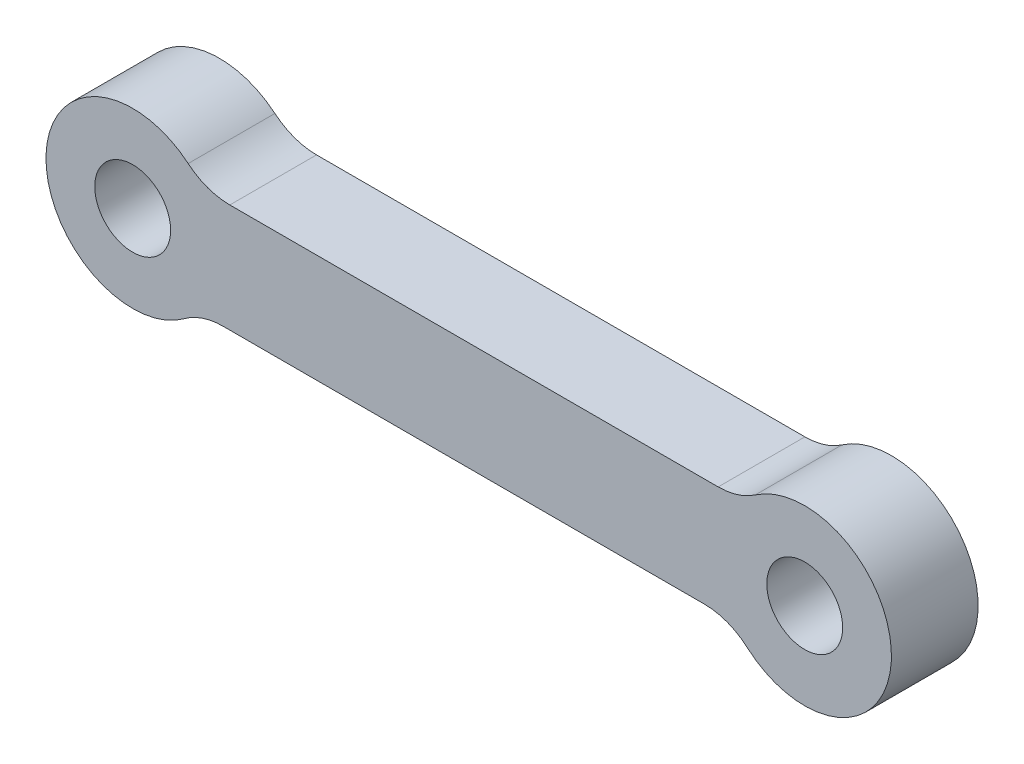
ISO-10303-21;
HEADER;
FILE_DESCRIPTION(('STEP AP214'),'2;1');
FILE_NAME('part.step','',(''),(''),'','','');
FILE_SCHEMA(('AUTOMOTIVE_DESIGN { 1 0 10303 214 1 1 1 1 }'));
ENDSEC;
DATA;
#1=APPLICATION_CONTEXT('core data for automotive mechanical design processes');
#2=APPLICATION_PROTOCOL_DEFINITION('international standard','automotive_design',2000,#1);
#3=PRODUCT_CONTEXT('',#1,'mechanical');
#4=PRODUCT('Part','Part','',(#3));
#5=PRODUCT_RELATED_PRODUCT_CATEGORY('part','',(#4));
#6=PRODUCT_DEFINITION_FORMATION('','',#4);
#7=PRODUCT_DEFINITION_CONTEXT('part definition',#1,'design');
#8=PRODUCT_DEFINITION('design','',#6,#7);
#9=PRODUCT_DEFINITION_SHAPE('','',#8);
#10=(LENGTH_UNIT() NAMED_UNIT(*) SI_UNIT(.MILLI.,.METRE.));
#11=(NAMED_UNIT(*) PLANE_ANGLE_UNIT() SI_UNIT($,.RADIAN.));
#12=(NAMED_UNIT(*) SI_UNIT($,.STERADIAN.) SOLID_ANGLE_UNIT());
#13=UNCERTAINTY_MEASURE_WITH_UNIT(LENGTH_MEASURE(1.E-05),#10,'distance_accuracy_value','');
#14=(GEOMETRIC_REPRESENTATION_CONTEXT(3) GLOBAL_UNCERTAINTY_ASSIGNED_CONTEXT((#13)) GLOBAL_UNIT_ASSIGNED_CONTEXT((#10,
#11,#12)) REPRESENTATION_CONTEXT('',''));
#15=CARTESIAN_POINT('',(0.,0.,0.));
#16=DIRECTION('',(0.,0.,1.));
#17=DIRECTION('',(1.,0.,0.));
#18=AXIS2_PLACEMENT_3D('',#15,#16,#17);
#19=CARTESIAN_POINT('',(11.2335382504417,-5.5,4.));
#20=DIRECTION('',(0.,0.,1.));
#21=DIRECTION('',(1.,0.,0.));
#22=AXIS2_PLACEMENT_3D('',#19,#20,#21);
#23=PLANE('',#22);
#24=CARTESIAN_POINT('',(-15.1331257009526,0.121587594832422,4.));
#25=DIRECTION('',(0.,0.,1.));
#26=DIRECTION('',(1.,0.,0.));
#27=AXIS2_PLACEMENT_3D('',#24,#25,#26);
#28=CIRCLE('',#27,1.75);
#29=CARTESIAN_POINT('',(-13.3831257009526,0.121587594832422,4.));
#30=VERTEX_POINT('',#29);
#31=EDGE_CURVE('E150',#30,#30,#28,.T.);
#32=ORIENTED_EDGE('',*,*,#31,.F.);
#33=EDGE_LOOP('',(#32));
#34=FACE_BOUND('',#33,.T.);
#35=CARTESIAN_POINT('',(11.2335382504417,-5.5,4.));
#36=DIRECTION('',(0.,0.,-1.));
#37=DIRECTION('',(1.,0.,0.));
#38=AXIS2_PLACEMENT_3D('',#35,#36,#37);
#39=CIRCLE('',#38,3.);
#40=CARTESIAN_POINT('',(11.2335382504417,-2.5,4.));
#41=VERTEX_POINT('',#40);
#42=CARTESIAN_POINT('',(13.2182945260088,-3.25039058354633,4.));
#43=VERTEX_POINT('',#42);
#44=EDGE_CURVE('E168',#41,#43,#39,.T.);
#45=ORIENTED_EDGE('',*,*,#44,.T.);
#46=CARTESIAN_POINT('',(15.8646362267649,-0.250911361608098,4.));
#47=DIRECTION('',(0.,0.,1.));
#48=DIRECTION('',(1.,0.,0.));
#49=AXIS2_PLACEMENT_3D('',#46,#47,#48);
#50=CIRCLE('',#49,4.);
#51=CARTESIAN_POINT('',(13.5841408626808,3.03532370216796,4.));
#52=VERTEX_POINT('',#51);
#53=EDGE_CURVE('E104',#43,#52,#50,.T.);
#54=ORIENTED_EDGE('',*,*,#53,.T.);
#55=CARTESIAN_POINT('',(11.8737693396178,5.5,4.));
#56=DIRECTION('',(0.,0.,-1.));
#57=DIRECTION('',(1.,0.,0.));
#58=AXIS2_PLACEMENT_3D('',#55,#56,#57);
#59=CIRCLE('',#58,3.);
#60=CARTESIAN_POINT('',(11.8737693396178,2.5,4.));
#61=VERTEX_POINT('',#60);
#62=EDGE_CURVE('E189',#52,#61,#59,.T.);
#63=ORIENTED_EDGE('',*,*,#62,.T.);
#64=DIRECTION('',(-1.,0.,0.));
#65=VECTOR('',#64,1.);
#66=CARTESIAN_POINT('',(-10.6528712439,2.5,4.));
#67=LINE('',#66,#65);
#68=CARTESIAN_POINT('',(-10.6528712439,2.5,4.));
#69=VERTEX_POINT('',#68);
#70=EDGE_CURVE('E203',#61,#69,#67,.T.);
#71=ORIENTED_EDGE('',*,*,#70,.T.);
#72=CARTESIAN_POINT('',(-10.6528712439,5.5,4.));
#73=DIRECTION('',(0.,0.,-1.));
#74=DIRECTION('',(-1.,0.,0.));
#75=AXIS2_PLACEMENT_3D('',#72,#73,#74);
#76=CIRCLE('',#75,3.);
#77=CARTESIAN_POINT('',(-12.5729802969225,3.19496611207104,4.));
#78=VERTEX_POINT('',#77);
#79=EDGE_CURVE('E123',#69,#78,#76,.T.);
#80=ORIENTED_EDGE('',*,*,#79,.T.);
#81=CARTESIAN_POINT('',(-15.1331257009526,0.121587594832422,4.));
#82=DIRECTION('',(0.,0.,1.));
#83=DIRECTION('',(1.,0.,0.));
#84=AXIS2_PLACEMENT_3D('',#81,#82,#83);
#85=CIRCLE('',#84,4.);
#86=CARTESIAN_POINT('',(-12.7496620636021,-3.09074817364325,4.));
#87=VERTEX_POINT('',#86);
#88=EDGE_CURVE('E117',#78,#87,#85,.T.);
#89=ORIENTED_EDGE('',*,*,#88,.T.);
#90=CARTESIAN_POINT('',(-10.9620643355893,-5.5,4.));
#91=DIRECTION('',(0.,0.,-1.));
#92=DIRECTION('',(-1.,0.,0.));
#93=AXIS2_PLACEMENT_3D('',#90,#91,#92);
#94=CIRCLE('',#93,3.);
#95=CARTESIAN_POINT('',(-10.9620643355893,-2.5,4.));
#96=VERTEX_POINT('',#95);
#97=EDGE_CURVE('E121',#87,#96,#94,.T.);
#98=ORIENTED_EDGE('',*,*,#97,.T.);
#99=DIRECTION('',(1.,0.,0.));
#100=VECTOR('',#99,1.);
#101=CARTESIAN_POINT('',(-10.9620643355893,-2.5,4.));
#102=LINE('',#101,#100);
#103=EDGE_CURVE('E61',#96,#41,#102,.T.);
#104=ORIENTED_EDGE('',*,*,#103,.T.);
#105=EDGE_LOOP('',(#45,#54,#63,#71,#80,#89,#98,#104));
#106=FACE_BOUND('',#105,.T.);
#107=CARTESIAN_POINT('',(15.8646362267649,-0.250911361608098,4.));
#108=DIRECTION('',(0.,0.,1.));
#109=DIRECTION('',(1.,0.,0.));
#110=AXIS2_PLACEMENT_3D('',#107,#108,#109);
#111=CIRCLE('',#110,1.75);
#112=CARTESIAN_POINT('',(17.6146362267649,-0.250911361608098,4.));
#113=VERTEX_POINT('',#112);
#114=EDGE_CURVE('E217',#113,#113,#111,.T.);
#115=ORIENTED_EDGE('',*,*,#114,.F.);
#116=EDGE_LOOP('',(#115));
#117=FACE_BOUND('',#116,.T.);
#118=ADVANCED_FACE('F43',(#34,#106,#117),#23,.T.);
#119=CARTESIAN_POINT('',(11.2335382504417,-5.5,0.));
#120=DIRECTION('',(0.,0.,1.));
#121=DIRECTION('',(1.,0.,0.));
#122=AXIS2_PLACEMENT_3D('',#119,#120,#121);
#123=PLANE('',#122);
#124=CARTESIAN_POINT('',(11.2335382504417,-5.5,0.));
#125=DIRECTION('',(0.,0.,-1.));
#126=DIRECTION('',(1.,0.,0.));
#127=AXIS2_PLACEMENT_3D('',#124,#125,#126);
#128=CIRCLE('',#127,3.);
#129=CARTESIAN_POINT('',(11.2335382504417,-2.5,0.));
#130=VERTEX_POINT('',#129);
#131=CARTESIAN_POINT('',(13.2182945260088,-3.25039058354633,0.));
#132=VERTEX_POINT('',#131);
#133=EDGE_CURVE('E145',#130,#132,#128,.T.);
#134=ORIENTED_EDGE('',*,*,#133,.F.);
#135=DIRECTION('',(1.,0.,0.));
#136=VECTOR('',#135,1.);
#137=CARTESIAN_POINT('',(-10.9620643355893,-2.5,0.));
#138=LINE('',#137,#136);
#139=CARTESIAN_POINT('',(-10.9620643355893,-2.5,0.));
#140=VERTEX_POINT('',#139);
#141=EDGE_CURVE('E96',#140,#130,#138,.T.);
#142=ORIENTED_EDGE('',*,*,#141,.F.);
#143=CARTESIAN_POINT('',(-10.9620643355893,-5.5,0.));
#144=DIRECTION('',(0.,0.,-1.));
#145=DIRECTION('',(-1.,0.,0.));
#146=AXIS2_PLACEMENT_3D('',#143,#144,#145);
#147=CIRCLE('',#146,3.);
#148=CARTESIAN_POINT('',(-12.7496620636021,-3.09074817364325,0.));
#149=VERTEX_POINT('',#148);
#150=EDGE_CURVE('E90',#149,#140,#147,.T.);
#151=ORIENTED_EDGE('',*,*,#150,.F.);
#152=CARTESIAN_POINT('',(-15.1331257009526,0.121587594832422,0.));
#153=DIRECTION('',(0.,0.,1.));
#154=DIRECTION('',(1.,0.,0.));
#155=AXIS2_PLACEMENT_3D('',#152,#153,#154);
#156=CIRCLE('',#155,4.);
#157=CARTESIAN_POINT('',(-12.5729802969225,3.19496611207104,0.));
#158=VERTEX_POINT('',#157);
#159=EDGE_CURVE('E132',#158,#149,#156,.T.);
#160=ORIENTED_EDGE('',*,*,#159,.F.);
#161=CARTESIAN_POINT('',(-10.6528712439,5.5,0.));
#162=DIRECTION('',(0.,0.,-1.));
#163=DIRECTION('',(-1.,0.,0.));
#164=AXIS2_PLACEMENT_3D('',#161,#162,#163);
#165=CIRCLE('',#164,3.);
#166=CARTESIAN_POINT('',(-10.6528712439,2.5,0.));
#167=VERTEX_POINT('',#166);
#168=EDGE_CURVE('E159',#167,#158,#165,.T.);
#169=ORIENTED_EDGE('',*,*,#168,.F.);
#170=DIRECTION('',(-1.,0.,0.));
#171=VECTOR('',#170,1.);
#172=CARTESIAN_POINT('',(-10.6528712439,2.5,0.));
#173=LINE('',#172,#171);
#174=CARTESIAN_POINT('',(11.8737693396178,2.5,0.));
#175=VERTEX_POINT('',#174);
#176=EDGE_CURVE('E156',#175,#167,#173,.T.);
#177=ORIENTED_EDGE('',*,*,#176,.F.);
#178=CARTESIAN_POINT('',(11.8737693396178,5.5,0.));
#179=DIRECTION('',(0.,0.,-1.));
#180=DIRECTION('',(1.,0.,0.));
#181=AXIS2_PLACEMENT_3D('',#178,#179,#180);
#182=CIRCLE('',#181,3.);
#183=CARTESIAN_POINT('',(13.5841408626808,3.03532370216796,0.));
#184=VERTEX_POINT('',#183);
#185=EDGE_CURVE('E153',#184,#175,#182,.T.);
#186=ORIENTED_EDGE('',*,*,#185,.F.);
#187=CARTESIAN_POINT('',(15.8646362267649,-0.250911361608098,0.));
#188=DIRECTION('',(0.,0.,1.));
#189=DIRECTION('',(1.,0.,0.));
#190=AXIS2_PLACEMENT_3D('',#187,#188,#189);
#191=CIRCLE('',#190,4.);
#192=EDGE_CURVE('E149',#132,#184,#191,.T.);
#193=ORIENTED_EDGE('',*,*,#192,.F.);
#194=EDGE_LOOP('',(#134,#142,#151,#160,#169,#177,#186,#193));
#195=FACE_BOUND('',#194,.T.);
#196=CARTESIAN_POINT('',(-15.1331257009526,0.121587594832422,0.));
#197=DIRECTION('',(0.,0.,1.));
#198=DIRECTION('',(1.,0.,0.));
#199=AXIS2_PLACEMENT_3D('',#196,#197,#198);
#200=CIRCLE('',#199,1.75);
#201=CARTESIAN_POINT('',(-13.3831257009526,0.121587594832422,0.));
#202=VERTEX_POINT('',#201);
#203=EDGE_CURVE('E213',#202,#202,#200,.T.);
#204=ORIENTED_EDGE('',*,*,#203,.T.);
#205=EDGE_LOOP('',(#204));
#206=FACE_BOUND('',#205,.T.);
#207=CARTESIAN_POINT('',(15.8646362267649,-0.250911361608098,0.));
#208=DIRECTION('',(0.,0.,1.));
#209=DIRECTION('',(1.,0.,0.));
#210=AXIS2_PLACEMENT_3D('',#207,#208,#209);
#211=CIRCLE('',#210,1.75);
#212=CARTESIAN_POINT('',(17.6146362267649,-0.250911361608098,0.));
#213=VERTEX_POINT('',#212);
#214=EDGE_CURVE('E221',#213,#213,#211,.T.);
#215=ORIENTED_EDGE('',*,*,#214,.T.);
#216=EDGE_LOOP('',(#215));
#217=FACE_BOUND('',#216,.T.);
#218=ADVANCED_FACE('F193',(#195,#206,#217),#123,.F.);
#219=CARTESIAN_POINT('',(11.2335382504417,-5.5,4.));
#220=DIRECTION('',(0.,0.,-1.));
#221=DIRECTION('',(-1.,0.,0.));
#222=AXIS2_PLACEMENT_3D('',#219,#220,#221);
#223=CYLINDRICAL_SURFACE('',#222,3.);
#224=ORIENTED_EDGE('',*,*,#133,.T.);
#225=DIRECTION('',(0.,0.,-1.));
#226=VECTOR('',#225,1.);
#227=CARTESIAN_POINT('',(13.2182945260088,-3.25039058354633,4.));
#228=LINE('',#227,#226);
#229=EDGE_CURVE('E11',#43,#132,#228,.T.);
#230=ORIENTED_EDGE('',*,*,#229,.F.);
#231=ORIENTED_EDGE('',*,*,#44,.F.);
#232=DIRECTION('',(0.,0.,-1.));
#233=VECTOR('',#232,1.);
#234=CARTESIAN_POINT('',(11.2335382504417,-2.5,4.));
#235=LINE('',#234,#233);
#236=EDGE_CURVE('E141',#41,#130,#235,.T.);
#237=ORIENTED_EDGE('',*,*,#236,.T.);
#238=EDGE_LOOP('',(#224,#230,#231,#237));
#239=FACE_BOUND('',#238,.T.);
#240=ADVANCED_FACE('F45',(#239),#223,.F.);
#241=CARTESIAN_POINT('',(15.8646362267649,-0.250911361608098,4.));
#242=DIRECTION('',(0.,0.,-1.));
#243=DIRECTION('',(-1.,0.,0.));
#244=AXIS2_PLACEMENT_3D('',#241,#242,#243);
#245=CYLINDRICAL_SURFACE('',#244,4.);
#246=ORIENTED_EDGE('',*,*,#192,.T.);
#247=DIRECTION('',(0.,0.,-1.));
#248=VECTOR('',#247,1.);
#249=CARTESIAN_POINT('',(13.5841408626808,3.03532370216796,4.));
#250=LINE('',#249,#248);
#251=EDGE_CURVE('E53',#52,#184,#250,.T.);
#252=ORIENTED_EDGE('',*,*,#251,.F.);
#253=ORIENTED_EDGE('',*,*,#53,.F.);
#254=ORIENTED_EDGE('',*,*,#229,.T.);
#255=EDGE_LOOP('',(#246,#252,#253,#254));
#256=FACE_BOUND('',#255,.T.);
#257=ADVANCED_FACE('F255',(#256),#245,.T.);
#258=CARTESIAN_POINT('',(11.8737693396178,5.5,4.));
#259=DIRECTION('',(0.,0.,-1.));
#260=DIRECTION('',(-1.,0.,0.));
#261=AXIS2_PLACEMENT_3D('',#258,#259,#260);
#262=CYLINDRICAL_SURFACE('',#261,3.);
#263=ORIENTED_EDGE('',*,*,#185,.T.);
#264=DIRECTION('',(0.,0.,-1.));
#265=VECTOR('',#264,1.);
#266=CARTESIAN_POINT('',(11.8737693396178,2.5,4.));
#267=LINE('',#266,#265);
#268=EDGE_CURVE('E179',#61,#175,#267,.T.);
#269=ORIENTED_EDGE('',*,*,#268,.F.);
#270=ORIENTED_EDGE('',*,*,#62,.F.);
#271=ORIENTED_EDGE('',*,*,#251,.T.);
#272=EDGE_LOOP('',(#263,#269,#270,#271));
#273=FACE_BOUND('',#272,.T.);
#274=ADVANCED_FACE('F187',(#273),#262,.F.);
#275=CARTESIAN_POINT('',(-10.6528712439,2.5,4.));
#276=DIRECTION('',(0.,-1.,0.));
#277=DIRECTION('',(1.,0.,0.));
#278=AXIS2_PLACEMENT_3D('',#275,#276,#277);
#279=PLANE('',#278);
#280=ORIENTED_EDGE('',*,*,#176,.T.);
#281=DIRECTION('',(0.,0.,-1.));
#282=VECTOR('',#281,1.);
#283=CARTESIAN_POINT('',(-10.6528712439,2.5,4.));
#284=LINE('',#283,#282);
#285=EDGE_CURVE('E175',#69,#167,#284,.T.);
#286=ORIENTED_EDGE('',*,*,#285,.F.);
#287=ORIENTED_EDGE('',*,*,#70,.F.);
#288=ORIENTED_EDGE('',*,*,#268,.T.);
#289=EDGE_LOOP('',(#280,#286,#287,#288));
#290=FACE_BOUND('',#289,.T.);
#291=ADVANCED_FACE('F198',(#290),#279,.F.);
#292=CARTESIAN_POINT('',(-10.6528712439,5.5,4.));
#293=DIRECTION('',(0.,0.,-1.));
#294=DIRECTION('',(-1.,0.,0.));
#295=AXIS2_PLACEMENT_3D('',#292,#293,#294);
#296=CYLINDRICAL_SURFACE('',#295,3.);
#297=ORIENTED_EDGE('',*,*,#168,.T.);
#298=DIRECTION('',(0.,0.,-1.));
#299=VECTOR('',#298,1.);
#300=CARTESIAN_POINT('',(-12.5729802969225,3.19496611207104,4.));
#301=LINE('',#300,#299);
#302=EDGE_CURVE('E134',#78,#158,#301,.T.);
#303=ORIENTED_EDGE('',*,*,#302,.F.);
#304=ORIENTED_EDGE('',*,*,#79,.F.);
#305=ORIENTED_EDGE('',*,*,#285,.T.);
#306=EDGE_LOOP('',(#297,#303,#304,#305));
#307=FACE_BOUND('',#306,.T.);
#308=ADVANCED_FACE('F201',(#307),#296,.F.);
#309=CARTESIAN_POINT('',(-15.1331257009526,0.121587594832422,4.));
#310=DIRECTION('',(0.,0.,-1.));
#311=DIRECTION('',(-1.,0.,0.));
#312=AXIS2_PLACEMENT_3D('',#309,#310,#311);
#313=CYLINDRICAL_SURFACE('',#312,4.);
#314=ORIENTED_EDGE('',*,*,#159,.T.);
#315=DIRECTION('',(0.,0.,-1.));
#316=VECTOR('',#315,1.);
#317=CARTESIAN_POINT('',(-12.7496620636021,-3.09074817364325,4.));
#318=LINE('',#317,#316);
#319=EDGE_CURVE('E129',#87,#149,#318,.T.);
#320=ORIENTED_EDGE('',*,*,#319,.F.);
#321=ORIENTED_EDGE('',*,*,#88,.F.);
#322=ORIENTED_EDGE('',*,*,#302,.T.);
#323=EDGE_LOOP('',(#314,#320,#321,#322));
#324=FACE_BOUND('',#323,.T.);
#325=ADVANCED_FACE('F130',(#324),#313,.T.);
#326=CARTESIAN_POINT('',(-10.9620643355893,-5.5,4.));
#327=DIRECTION('',(0.,0.,-1.));
#328=DIRECTION('',(-1.,0.,0.));
#329=AXIS2_PLACEMENT_3D('',#326,#327,#328);
#330=CYLINDRICAL_SURFACE('',#329,3.);
#331=ORIENTED_EDGE('',*,*,#150,.T.);
#332=DIRECTION('',(0.,0.,-1.));
#333=VECTOR('',#332,1.);
#334=CARTESIAN_POINT('',(-10.9620643355893,-2.5,4.));
#335=LINE('',#334,#333);
#336=EDGE_CURVE('E135',#96,#140,#335,.T.);
#337=ORIENTED_EDGE('',*,*,#336,.F.);
#338=ORIENTED_EDGE('',*,*,#97,.F.);
#339=ORIENTED_EDGE('',*,*,#319,.T.);
#340=EDGE_LOOP('',(#331,#337,#338,#339));
#341=FACE_BOUND('',#340,.T.);
#342=ADVANCED_FACE('F137',(#341),#330,.F.);
#343=CARTESIAN_POINT('',(-10.9620643355893,-2.5,4.));
#344=DIRECTION('',(0.,1.,0.));
#345=DIRECTION('',(-1.,0.,0.));
#346=AXIS2_PLACEMENT_3D('',#343,#344,#345);
#347=PLANE('',#346);
#348=ORIENTED_EDGE('',*,*,#141,.T.);
#349=ORIENTED_EDGE('',*,*,#236,.F.);
#350=ORIENTED_EDGE('',*,*,#103,.F.);
#351=ORIENTED_EDGE('',*,*,#336,.T.);
#352=EDGE_LOOP('',(#348,#349,#350,#351));
#353=FACE_BOUND('',#352,.T.);
#354=ADVANCED_FACE('F243',(#353),#347,.F.);
#355=CARTESIAN_POINT('',(-15.1331257009526,0.121587594832422,4.));
#356=DIRECTION('',(0.,0.,-1.));
#357=DIRECTION('',(-1.,0.,0.));
#358=AXIS2_PLACEMENT_3D('',#355,#356,#357);
#359=CYLINDRICAL_SURFACE('',#358,1.75);
#360=ORIENTED_EDGE('',*,*,#31,.T.);
#361=EDGE_LOOP('',(#360));
#362=FACE_BOUND('',#361,.T.);
#363=ORIENTED_EDGE('',*,*,#203,.F.);
#364=EDGE_LOOP('',(#363));
#365=FACE_BOUND('',#364,.T.);
#366=ADVANCED_FACE('F240',(#362,#365),#359,.F.);
#367=CARTESIAN_POINT('',(15.8646362267649,-0.250911361608098,4.));
#368=DIRECTION('',(0.,0.,-1.));
#369=DIRECTION('',(-1.,0.,0.));
#370=AXIS2_PLACEMENT_3D('',#367,#368,#369);
#371=CYLINDRICAL_SURFACE('',#370,1.75);
#372=ORIENTED_EDGE('',*,*,#114,.T.);
#373=EDGE_LOOP('',(#372));
#374=FACE_BOUND('',#373,.T.);
#375=ORIENTED_EDGE('',*,*,#214,.F.);
#376=EDGE_LOOP('',(#375));
#377=FACE_BOUND('',#376,.T.);
#378=ADVANCED_FACE('F229',(#374,#377),#371,.F.);
#379=CLOSED_SHELL('',(#118,#218,#240,#257,#274,#291,#308,#325,#342,#354,#366,#378));
#380=MANIFOLD_SOLID_BREP('B2',#379);
#381=ADVANCED_BREP_SHAPE_REPRESENTATION('',(#18,#380),#14);
#382=SHAPE_DEFINITION_REPRESENTATION(#9,#381);
ENDSEC;
END-ISO-10303-21;
